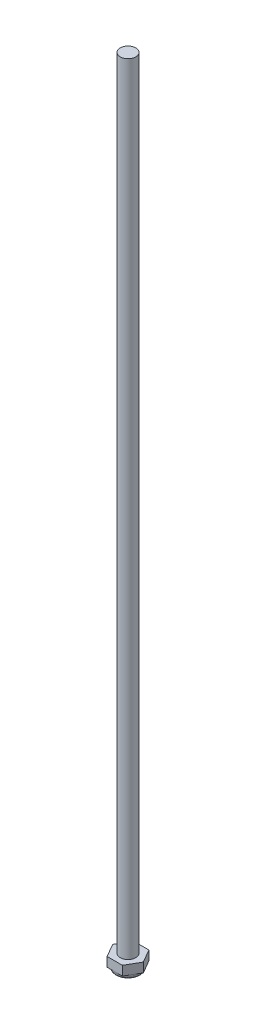
ISO-10303-21;
HEADER;
FILE_DESCRIPTION(('STEP AP214'),'2;1');
FILE_NAME('part.step','',(''),(''),'','','');
FILE_SCHEMA(('AUTOMOTIVE_DESIGN { 1 0 10303 214 1 1 1 1 }'));
ENDSEC;
DATA;
#1=APPLICATION_CONTEXT('core data for automotive mechanical design processes');
#2=APPLICATION_PROTOCOL_DEFINITION('international standard','automotive_design',2000,#1);
#3=PRODUCT_CONTEXT('',#1,'mechanical');
#4=PRODUCT('Part','Part','',(#3));
#5=PRODUCT_RELATED_PRODUCT_CATEGORY('part','',(#4));
#6=PRODUCT_DEFINITION_FORMATION('','',#4);
#7=PRODUCT_DEFINITION_CONTEXT('part definition',#1,'design');
#8=PRODUCT_DEFINITION('design','',#6,#7);
#9=PRODUCT_DEFINITION_SHAPE('','',#8);
#10=(LENGTH_UNIT() NAMED_UNIT(*) SI_UNIT(.MILLI.,.METRE.));
#11=(NAMED_UNIT(*) PLANE_ANGLE_UNIT() SI_UNIT($,.RADIAN.));
#12=(NAMED_UNIT(*) SI_UNIT($,.STERADIAN.) SOLID_ANGLE_UNIT());
#13=UNCERTAINTY_MEASURE_WITH_UNIT(LENGTH_MEASURE(1.E-05),#10,'distance_accuracy_value','');
#14=(GEOMETRIC_REPRESENTATION_CONTEXT(3) GLOBAL_UNCERTAINTY_ASSIGNED_CONTEXT((#13)) GLOBAL_UNIT_ASSIGNED_CONTEXT((#10,
#11,#12)) REPRESENTATION_CONTEXT('',''));
#15=CARTESIAN_POINT('',(0.,0.,0.));
#16=DIRECTION('',(0.,0.,1.));
#17=DIRECTION('',(1.,0.,0.));
#18=AXIS2_PLACEMENT_3D('',#15,#16,#17);
#19=CARTESIAN_POINT('',(-4.90747728811182,6.,8.5));
#20=DIRECTION('',(0.,0.,-1.));
#21=DIRECTION('',(-1.,0.,0.));
#22=AXIS2_PLACEMENT_3D('',#19,#20,#21);
#23=PLANE('',#22);
#24=DIRECTION('',(1.,0.,0.));
#25=VECTOR('',#24,1.);
#26=CARTESIAN_POINT('',(-4.90747728811182,0.,8.5));
#27=LINE('',#26,#25);
#28=CARTESIAN_POINT('',(-4.90747728811182,0.,8.5));
#29=VERTEX_POINT('',#28);
#30=CARTESIAN_POINT('',(4.90747728811182,0.,8.5));
#31=VERTEX_POINT('',#30);
#32=EDGE_CURVE('E131',#29,#31,#27,.T.);
#33=ORIENTED_EDGE('',*,*,#32,.T.);
#34=DIRECTION('',(0.,-1.,0.));
#35=VECTOR('',#34,1.);
#36=CARTESIAN_POINT('',(4.90747728811182,6.,8.5));
#37=LINE('',#36,#35);
#38=CARTESIAN_POINT('',(4.90747728811182,6.,8.5));
#39=VERTEX_POINT('',#38);
#40=EDGE_CURVE('E159',#39,#31,#37,.T.);
#41=ORIENTED_EDGE('',*,*,#40,.F.);
#42=DIRECTION('',(1.,0.,0.));
#43=VECTOR('',#42,1.);
#44=CARTESIAN_POINT('',(-4.90747728811182,6.,8.5));
#45=LINE('',#44,#43);
#46=CARTESIAN_POINT('',(-4.90747728811182,6.,8.5));
#47=VERTEX_POINT('',#46);
#48=EDGE_CURVE('E148',#47,#39,#45,.T.);
#49=ORIENTED_EDGE('',*,*,#48,.F.);
#50=DIRECTION('',(0.,-1.,0.));
#51=VECTOR('',#50,1.);
#52=CARTESIAN_POINT('',(-4.90747728811182,6.,8.5));
#53=LINE('',#52,#51);
#54=EDGE_CURVE('E127',#47,#29,#53,.T.);
#55=ORIENTED_EDGE('',*,*,#54,.T.);
#56=EDGE_LOOP('',(#33,#41,#49,#55));
#57=FACE_BOUND('',#56,.T.);
#58=ADVANCED_FACE('F39',(#57),#23,.F.);
#59=CARTESIAN_POINT('',(4.90747728811182,6.,8.5));
#60=DIRECTION('',(-0.866025403784439,0.,-0.5));
#61=DIRECTION('',(-0.5,0.,0.866025403784439));
#62=AXIS2_PLACEMENT_3D('',#59,#60,#61);
#63=PLANE('',#62);
#64=DIRECTION('',(0.5,0.,-0.866025403784439));
#65=VECTOR('',#64,1.);
#66=CARTESIAN_POINT('',(4.90747728811182,0.,8.5));
#67=LINE('',#66,#65);
#68=CARTESIAN_POINT('',(9.81495457622364,0.,0.));
#69=VERTEX_POINT('',#68);
#70=EDGE_CURVE('E135',#31,#69,#67,.T.);
#71=ORIENTED_EDGE('',*,*,#70,.T.);
#72=DIRECTION('',(0.,-1.,0.));
#73=VECTOR('',#72,1.);
#74=CARTESIAN_POINT('',(9.81495457622364,6.,0.));
#75=LINE('',#74,#73);
#76=CARTESIAN_POINT('',(9.81495457622364,6.,0.));
#77=VERTEX_POINT('',#76);
#78=EDGE_CURVE('E155',#77,#69,#75,.T.);
#79=ORIENTED_EDGE('',*,*,#78,.F.);
#80=DIRECTION('',(0.5,0.,-0.866025403784439));
#81=VECTOR('',#80,1.);
#82=CARTESIAN_POINT('',(4.90747728811182,6.,8.5));
#83=LINE('',#82,#81);
#84=EDGE_CURVE('E96',#39,#77,#83,.T.);
#85=ORIENTED_EDGE('',*,*,#84,.F.);
#86=ORIENTED_EDGE('',*,*,#40,.T.);
#87=EDGE_LOOP('',(#71,#79,#85,#86));
#88=FACE_BOUND('',#87,.T.);
#89=ADVANCED_FACE('F206',(#88),#63,.F.);
#90=CARTESIAN_POINT('',(9.81495457622364,6.,0.));
#91=DIRECTION('',(-0.866025403784439,0.,0.5));
#92=DIRECTION('',(0.5,0.,0.866025403784439));
#93=AXIS2_PLACEMENT_3D('',#90,#91,#92);
#94=PLANE('',#93);
#95=DIRECTION('',(-0.5,0.,-0.866025403784438));
#96=VECTOR('',#95,1.);
#97=CARTESIAN_POINT('',(9.81495457622364,0.,0.));
#98=LINE('',#97,#96);
#99=CARTESIAN_POINT('',(4.90747728811182,0.,-8.5));
#100=VERTEX_POINT('',#99);
#101=EDGE_CURVE('E139',#69,#100,#98,.T.);
#102=ORIENTED_EDGE('',*,*,#101,.T.);
#103=DIRECTION('',(0.,-1.,0.));
#104=VECTOR('',#103,1.);
#105=CARTESIAN_POINT('',(4.90747728811182,6.,-8.5));
#106=LINE('',#105,#104);
#107=CARTESIAN_POINT('',(4.90747728811182,6.,-8.5));
#108=VERTEX_POINT('',#107);
#109=EDGE_CURVE('E120',#108,#100,#106,.T.);
#110=ORIENTED_EDGE('',*,*,#109,.F.);
#111=DIRECTION('',(-0.5,0.,-0.866025403784438));
#112=VECTOR('',#111,1.);
#113=CARTESIAN_POINT('',(9.81495457622364,6.,0.));
#114=LINE('',#113,#112);
#115=EDGE_CURVE('E109',#77,#108,#114,.T.);
#116=ORIENTED_EDGE('',*,*,#115,.F.);
#117=ORIENTED_EDGE('',*,*,#78,.T.);
#118=EDGE_LOOP('',(#102,#110,#116,#117));
#119=FACE_BOUND('',#118,.T.);
#120=ADVANCED_FACE('F211',(#119),#94,.F.);
#121=CARTESIAN_POINT('',(4.90747728811182,6.,-8.5));
#122=DIRECTION('',(0.,0.,1.));
#123=DIRECTION('',(1.,0.,0.));
#124=AXIS2_PLACEMENT_3D('',#121,#122,#123);
#125=PLANE('',#124);
#126=DIRECTION('',(-1.,0.,0.));
#127=VECTOR('',#126,1.);
#128=CARTESIAN_POINT('',(4.90747728811182,0.,-8.5));
#129=LINE('',#128,#127);
#130=CARTESIAN_POINT('',(-4.90747728811182,0.,-8.5));
#131=VERTEX_POINT('',#130);
#132=EDGE_CURVE('E118',#100,#131,#129,.T.);
#133=ORIENTED_EDGE('',*,*,#132,.T.);
#134=DIRECTION('',(0.,-1.,0.));
#135=VECTOR('',#134,1.);
#136=CARTESIAN_POINT('',(-4.90747728811182,6.,-8.5));
#137=LINE('',#136,#135);
#138=CARTESIAN_POINT('',(-4.90747728811182,6.,-8.5));
#139=VERTEX_POINT('',#138);
#140=EDGE_CURVE('E115',#139,#131,#137,.T.);
#141=ORIENTED_EDGE('',*,*,#140,.F.);
#142=DIRECTION('',(-1.,0.,0.));
#143=VECTOR('',#142,1.);
#144=CARTESIAN_POINT('',(4.90747728811182,6.,-8.5));
#145=LINE('',#144,#143);
#146=EDGE_CURVE('E103',#108,#139,#145,.T.);
#147=ORIENTED_EDGE('',*,*,#146,.F.);
#148=ORIENTED_EDGE('',*,*,#109,.T.);
#149=EDGE_LOOP('',(#133,#141,#147,#148));
#150=FACE_BOUND('',#149,.T.);
#151=ADVANCED_FACE('F116',(#150),#125,.F.);
#152=CARTESIAN_POINT('',(-4.90747728811182,6.,-8.5));
#153=DIRECTION('',(0.866025403784438,0.,0.5));
#154=DIRECTION('',(0.5,0.,-0.866025403784439));
#155=AXIS2_PLACEMENT_3D('',#152,#153,#154);
#156=PLANE('',#155);
#157=DIRECTION('',(-0.5,0.,0.866025403784439));
#158=VECTOR('',#157,1.);
#159=CARTESIAN_POINT('',(-4.90747728811182,0.,-8.5));
#160=LINE('',#159,#158);
#161=CARTESIAN_POINT('',(-9.81495457622364,0.,0.));
#162=VERTEX_POINT('',#161);
#163=EDGE_CURVE('E81',#131,#162,#160,.T.);
#164=ORIENTED_EDGE('',*,*,#163,.T.);
#165=DIRECTION('',(0.,-1.,0.));
#166=VECTOR('',#165,1.);
#167=CARTESIAN_POINT('',(-9.81495457622364,6.,0.));
#168=LINE('',#167,#166);
#169=CARTESIAN_POINT('',(-9.81495457622364,6.,0.));
#170=VERTEX_POINT('',#169);
#171=EDGE_CURVE('E121',#170,#162,#168,.T.);
#172=ORIENTED_EDGE('',*,*,#171,.F.);
#173=DIRECTION('',(-0.5,0.,0.866025403784439));
#174=VECTOR('',#173,1.);
#175=CARTESIAN_POINT('',(-4.90747728811182,6.,-8.5));
#176=LINE('',#175,#174);
#177=EDGE_CURVE('E107',#139,#170,#176,.T.);
#178=ORIENTED_EDGE('',*,*,#177,.F.);
#179=ORIENTED_EDGE('',*,*,#140,.T.);
#180=EDGE_LOOP('',(#164,#172,#178,#179));
#181=FACE_BOUND('',#180,.T.);
#182=ADVANCED_FACE('F123',(#181),#156,.F.);
#183=CARTESIAN_POINT('',(-9.81495457622364,6.,0.));
#184=DIRECTION('',(0.866025403784438,0.,-0.5));
#185=DIRECTION('',(-0.5,0.,-0.866025403784439));
#186=AXIS2_PLACEMENT_3D('',#183,#184,#185);
#187=PLANE('',#186);
#188=DIRECTION('',(0.5,0.,0.866025403784439));
#189=VECTOR('',#188,1.);
#190=CARTESIAN_POINT('',(-9.81495457622364,0.,0.));
#191=LINE('',#190,#189);
#192=EDGE_CURVE('E87',#162,#29,#191,.T.);
#193=ORIENTED_EDGE('',*,*,#192,.T.);
#194=ORIENTED_EDGE('',*,*,#54,.F.);
#195=DIRECTION('',(0.5,0.,0.866025403784439));
#196=VECTOR('',#195,1.);
#197=CARTESIAN_POINT('',(-9.81495457622364,6.,0.));
#198=LINE('',#197,#196);
#199=EDGE_CURVE('E58',#170,#47,#198,.T.);
#200=ORIENTED_EDGE('',*,*,#199,.F.);
#201=ORIENTED_EDGE('',*,*,#171,.T.);
#202=EDGE_LOOP('',(#193,#194,#200,#201));
#203=FACE_BOUND('',#202,.T.);
#204=ADVANCED_FACE('F194',(#203),#187,.F.);
#205=CARTESIAN_POINT('',(0.,6.,0.));
#206=DIRECTION('',(0.,1.,0.));
#207=DIRECTION('',(0.,0.,1.));
#208=AXIS2_PLACEMENT_3D('',#205,#206,#207);
#209=PLANE('',#208);
#210=CARTESIAN_POINT('',(0.,6.,0.));
#211=DIRECTION('',(0.,1.,0.));
#212=DIRECTION('',(0.,0.,1.));
#213=AXIS2_PLACEMENT_3D('',#210,#211,#212);
#214=CIRCLE('',#213,5.);
#215=CARTESIAN_POINT('',(0.,6.,5.));
#216=VERTEX_POINT('',#215);
#217=EDGE_CURVE('E11',#216,#216,#214,.T.);
#218=ORIENTED_EDGE('',*,*,#217,.F.);
#219=EDGE_LOOP('',(#218));
#220=FACE_BOUND('',#219,.T.);
#221=ORIENTED_EDGE('',*,*,#48,.T.);
#222=ORIENTED_EDGE('',*,*,#84,.T.);
#223=ORIENTED_EDGE('',*,*,#115,.T.);
#224=ORIENTED_EDGE('',*,*,#146,.T.);
#225=ORIENTED_EDGE('',*,*,#177,.T.);
#226=ORIENTED_EDGE('',*,*,#199,.T.);
#227=EDGE_LOOP('',(#221,#222,#223,#224,#225,#226));
#228=FACE_BOUND('',#227,.T.);
#229=ADVANCED_FACE('F105',(#220,#228),#209,.T.);
#230=CARTESIAN_POINT('',(0.,0.,0.));
#231=DIRECTION('',(0.,1.,0.));
#232=DIRECTION('',(0.,0.,1.));
#233=AXIS2_PLACEMENT_3D('',#230,#231,#232);
#234=PLANE('',#233);
#235=CARTESIAN_POINT('',(0.,0.,0.));
#236=DIRECTION('',(0.,-1.,0.));
#237=DIRECTION('',(0.,0.,-1.));
#238=AXIS2_PLACEMENT_3D('',#235,#236,#237);
#239=CIRCLE('',#238,8.1);
#240=CARTESIAN_POINT('',(0.,0.,-8.1));
#241=VERTEX_POINT('',#240);
#242=EDGE_CURVE('E161',#241,#241,#239,.T.);
#243=ORIENTED_EDGE('',*,*,#242,.F.);
#244=EDGE_LOOP('',(#243));
#245=FACE_BOUND('',#244,.T.);
#246=ORIENTED_EDGE('',*,*,#32,.F.);
#247=ORIENTED_EDGE('',*,*,#192,.F.);
#248=ORIENTED_EDGE('',*,*,#163,.F.);
#249=ORIENTED_EDGE('',*,*,#132,.F.);
#250=ORIENTED_EDGE('',*,*,#101,.F.);
#251=ORIENTED_EDGE('',*,*,#70,.F.);
#252=EDGE_LOOP('',(#246,#247,#248,#249,#250,#251));
#253=FACE_BOUND('',#252,.T.);
#254=ADVANCED_FACE('F193',(#245,#253),#234,.F.);
#255=CARTESIAN_POINT('',(0.,-3.,0.));
#256=DIRECTION('',(0.,1.,0.));
#257=DIRECTION('',(0.,0.,1.));
#258=AXIS2_PLACEMENT_3D('',#255,#256,#257);
#259=CYLINDRICAL_SURFACE('',#258,8.1);
#260=CARTESIAN_POINT('',(0.,-1.,0.));
#261=DIRECTION('',(0.,-1.,0.));
#262=DIRECTION('',(0.,0.,-1.));
#263=AXIS2_PLACEMENT_3D('',#260,#261,#262);
#264=CIRCLE('',#263,8.1);
#265=CARTESIAN_POINT('',(0.,-1.,-8.1));
#266=VERTEX_POINT('',#265);
#267=EDGE_CURVE('E43',#266,#266,#264,.F.);
#268=ORIENTED_EDGE('',*,*,#267,.T.);
#269=EDGE_LOOP('',(#268));
#270=FACE_BOUND('',#269,.T.);
#271=ORIENTED_EDGE('',*,*,#242,.T.);
#272=EDGE_LOOP('',(#271));
#273=FACE_BOUND('',#272,.T.);
#274=ADVANCED_FACE('F200',(#270,#273),#259,.T.);
#275=CARTESIAN_POINT('',(0.,-3.,0.));
#276=DIRECTION('',(0.,-1.,0.));
#277=DIRECTION('',(0.,0.,-1.));
#278=AXIS2_PLACEMENT_3D('',#275,#276,#277);
#279=PLANE('',#278);
#280=CARTESIAN_POINT('',(0.,-3.,0.));
#281=DIRECTION('',(0.,-1.,0.));
#282=DIRECTION('',(0.,0.,-1.));
#283=AXIS2_PLACEMENT_3D('',#280,#281,#282);
#284=CIRCLE('',#283,6.1);
#285=CARTESIAN_POINT('',(0.,-3.,-6.1));
#286=VERTEX_POINT('',#285);
#287=EDGE_CURVE('E162',#286,#286,#284,.T.);
#288=ORIENTED_EDGE('',*,*,#287,.T.);
#289=EDGE_LOOP('',(#288));
#290=FACE_BOUND('',#289,.T.);
#291=ADVANCED_FACE('F244',(#290),#279,.T.);
#292=CARTESIAN_POINT('',(0.,-1.,0.));
#293=DIRECTION('',(0.,-1.,0.));
#294=DIRECTION('',(0.,0.,-1.));
#295=AXIS2_PLACEMENT_3D('',#292,#293,#294);
#296=TOROIDAL_SURFACE('',#295,6.1,2.);
#297=ORIENTED_EDGE('',*,*,#267,.F.);
#298=EDGE_LOOP('',(#297));
#299=FACE_BOUND('',#298,.T.);
#300=ORIENTED_EDGE('',*,*,#287,.F.);
#301=EDGE_LOOP('',(#300));
#302=FACE_BOUND('',#301,.T.);
#303=ADVANCED_FACE('F41',(#299,#302),#296,.T.);
#304=CARTESIAN_POINT('',(0.,506.,0.));
#305=DIRECTION('',(0.,-1.,0.));
#306=DIRECTION('',(0.,0.,-1.));
#307=AXIS2_PLACEMENT_3D('',#304,#305,#306);
#308=CYLINDRICAL_SURFACE('',#307,5.);
#309=CARTESIAN_POINT('',(0.,506.,0.));
#310=DIRECTION('',(0.,1.,0.));
#311=DIRECTION('',(0.,0.,1.));
#312=AXIS2_PLACEMENT_3D('',#309,#310,#311);
#313=CIRCLE('',#312,5.);
#314=CARTESIAN_POINT('',(0.,506.,5.));
#315=VERTEX_POINT('',#314);
#316=EDGE_CURVE('E136',#315,#315,#313,.T.);
#317=ORIENTED_EDGE('',*,*,#316,.F.);
#318=EDGE_LOOP('',(#317));
#319=FACE_BOUND('',#318,.T.);
#320=ORIENTED_EDGE('',*,*,#217,.T.);
#321=EDGE_LOOP('',(#320));
#322=FACE_BOUND('',#321,.T.);
#323=ADVANCED_FACE('F186',(#319,#322),#308,.T.);
#324=CARTESIAN_POINT('',(0.,506.,0.));
#325=DIRECTION('',(0.,1.,0.));
#326=DIRECTION('',(0.,0.,1.));
#327=AXIS2_PLACEMENT_3D('',#324,#325,#326);
#328=PLANE('',#327);
#329=ORIENTED_EDGE('',*,*,#316,.T.);
#330=EDGE_LOOP('',(#329));
#331=FACE_BOUND('',#330,.T.);
#332=ADVANCED_FACE('F184',(#331),#328,.T.);
#333=CLOSED_SHELL('',(#58,#89,#120,#151,#182,#204,#229,#254,#274,#291,#303,#323,#332));
#334=MANIFOLD_SOLID_BREP('B2',#333);
#335=ADVANCED_BREP_SHAPE_REPRESENTATION('',(#18,#334),#14);
#336=SHAPE_DEFINITION_REPRESENTATION(#9,#335);
ENDSEC;
END-ISO-10303-21;
